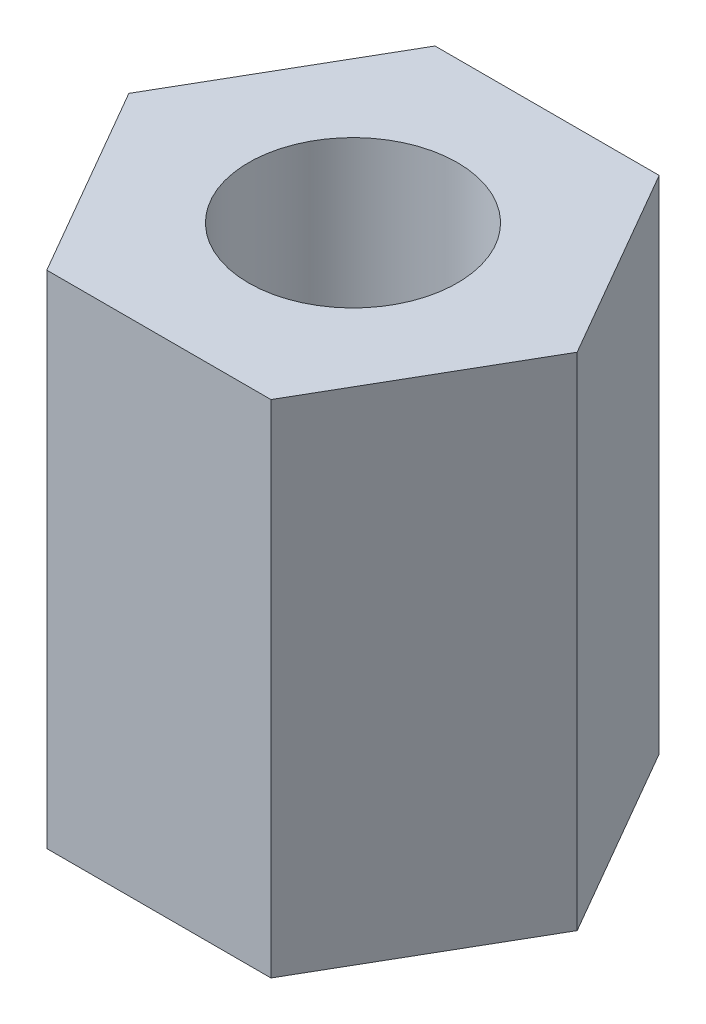
ISO-10303-21;
HEADER;
FILE_DESCRIPTION(('STEP AP214'),'2;1');
FILE_NAME('part.step','',(''),(''),'','','');
FILE_SCHEMA(('AUTOMOTIVE_DESIGN { 1 0 10303 214 1 1 1 1 }'));
ENDSEC;
DATA;
#1=APPLICATION_CONTEXT('core data for automotive mechanical design processes');
#2=APPLICATION_PROTOCOL_DEFINITION('international standard','automotive_design',2000,#1);
#3=PRODUCT_CONTEXT('',#1,'mechanical');
#4=PRODUCT('Part','Part','',(#3));
#5=PRODUCT_RELATED_PRODUCT_CATEGORY('part','',(#4));
#6=PRODUCT_DEFINITION_FORMATION('','',#4);
#7=PRODUCT_DEFINITION_CONTEXT('part definition',#1,'design');
#8=PRODUCT_DEFINITION('design','',#6,#7);
#9=PRODUCT_DEFINITION_SHAPE('','',#8);
#10=(LENGTH_UNIT() NAMED_UNIT(*) SI_UNIT(.MILLI.,.METRE.));
#11=(NAMED_UNIT(*) PLANE_ANGLE_UNIT() SI_UNIT($,.RADIAN.));
#12=(NAMED_UNIT(*) SI_UNIT($,.STERADIAN.) SOLID_ANGLE_UNIT());
#13=UNCERTAINTY_MEASURE_WITH_UNIT(LENGTH_MEASURE(1.E-05),#10,'distance_accuracy_value','');
#14=(GEOMETRIC_REPRESENTATION_CONTEXT(3) GLOBAL_UNCERTAINTY_ASSIGNED_CONTEXT((#13)) GLOBAL_UNIT_ASSIGNED_CONTEXT((#10,
#11,#12)) REPRESENTATION_CONTEXT('',''));
#15=CARTESIAN_POINT('',(0.,0.,0.));
#16=DIRECTION('',(0.,0.,1.));
#17=DIRECTION('',(1.,0.,0.));
#18=AXIS2_PLACEMENT_3D('',#15,#16,#17);
#19=CARTESIAN_POINT('',(1.34233937586591,6.,2.32499999999999));
#20=DIRECTION('',(-0.866025403784441,0.,-0.499999999999995));
#21=DIRECTION('',(-0.499999999999995,0.,0.866025403784442));
#22=AXIS2_PLACEMENT_3D('',#19,#20,#21);
#23=PLANE('',#22);
#24=DIRECTION('',(0.499999999999995,0.,-0.866025403784442));
#25=VECTOR('',#24,1.);
#26=CARTESIAN_POINT('',(1.34233937586591,0.,2.32499999999999));
#27=LINE('',#26,#25);
#28=CARTESIAN_POINT('',(1.34233937586591,0.,2.32499999999999));
#29=VERTEX_POINT('',#28);
#30=CARTESIAN_POINT('',(2.68467875173176,0.,0.));
#31=VERTEX_POINT('',#30);
#32=EDGE_CURVE('E128',#29,#31,#27,.T.);
#33=ORIENTED_EDGE('',*,*,#32,.T.);
#34=DIRECTION('',(0.,-1.,0.));
#35=VECTOR('',#34,1.);
#36=CARTESIAN_POINT('',(2.68467875173176,6.,0.));
#37=LINE('',#36,#35);
#38=CARTESIAN_POINT('',(2.68467875173176,6.,0.));
#39=VERTEX_POINT('',#38);
#40=EDGE_CURVE('E11',#39,#31,#37,.T.);
#41=ORIENTED_EDGE('',*,*,#40,.F.);
#42=DIRECTION('',(0.499999999999995,0.,-0.866025403784442));
#43=VECTOR('',#42,1.);
#44=CARTESIAN_POINT('',(1.34233937586591,6.,2.32499999999999));
#45=LINE('',#44,#43);
#46=CARTESIAN_POINT('',(1.34233937586591,6.,2.32499999999999));
#47=VERTEX_POINT('',#46);
#48=EDGE_CURVE('E145',#47,#39,#45,.T.);
#49=ORIENTED_EDGE('',*,*,#48,.F.);
#50=DIRECTION('',(0.,-1.,0.));
#51=VECTOR('',#50,1.);
#52=CARTESIAN_POINT('',(1.34233937586591,6.,2.32499999999999));
#53=LINE('',#52,#51);
#54=EDGE_CURVE('E124',#47,#29,#53,.T.);
#55=ORIENTED_EDGE('',*,*,#54,.T.);
#56=EDGE_LOOP('',(#33,#41,#49,#55));
#57=FACE_BOUND('',#56,.T.);
#58=ADVANCED_FACE('F39',(#57),#23,.F.);
#59=CARTESIAN_POINT('',(2.68467875173176,6.,0.));
#60=DIRECTION('',(-0.866025403784438,0.,0.500000000000001));
#61=DIRECTION('',(0.500000000000001,0.,0.866025403784438));
#62=AXIS2_PLACEMENT_3D('',#59,#60,#61);
#63=PLANE('',#62);
#64=DIRECTION('',(-0.500000000000001,0.,-0.866025403784438));
#65=VECTOR('',#64,1.);
#66=CARTESIAN_POINT('',(2.68467875173176,0.,0.));
#67=LINE('',#66,#65);
#68=CARTESIAN_POINT('',(1.34233937586588,0.,-2.32500000000001));
#69=VERTEX_POINT('',#68);
#70=EDGE_CURVE('E132',#31,#69,#67,.T.);
#71=ORIENTED_EDGE('',*,*,#70,.T.);
#72=DIRECTION('',(0.,-1.,0.));
#73=VECTOR('',#72,1.);
#74=CARTESIAN_POINT('',(1.34233937586588,6.,-2.32500000000001));
#75=LINE('',#74,#73);
#76=CARTESIAN_POINT('',(1.34233937586588,6.,-2.32500000000001));
#77=VERTEX_POINT('',#76);
#78=EDGE_CURVE('E48',#77,#69,#75,.T.);
#79=ORIENTED_EDGE('',*,*,#78,.F.);
#80=DIRECTION('',(-0.500000000000001,0.,-0.866025403784438));
#81=VECTOR('',#80,1.);
#82=CARTESIAN_POINT('',(2.68467875173176,6.,0.));
#83=LINE('',#82,#81);
#84=EDGE_CURVE('E93',#39,#77,#83,.T.);
#85=ORIENTED_EDGE('',*,*,#84,.F.);
#86=ORIENTED_EDGE('',*,*,#40,.T.);
#87=EDGE_LOOP('',(#71,#79,#85,#86));
#88=FACE_BOUND('',#87,.T.);
#89=ADVANCED_FACE('F174',(#88),#63,.F.);
#90=CARTESIAN_POINT('',(1.34233937586588,6.,-2.32500000000001));
#91=DIRECTION('',(0.,0.,1.));
#92=DIRECTION('',(1.,0.,0.));
#93=AXIS2_PLACEMENT_3D('',#90,#91,#92);
#94=PLANE('',#93);
#95=DIRECTION('',(-1.,0.,0.));
#96=VECTOR('',#95,1.);
#97=CARTESIAN_POINT('',(1.34233937586588,0.,-2.32500000000001));
#98=LINE('',#97,#96);
#99=CARTESIAN_POINT('',(-1.34233937586589,0.,-2.325));
#100=VERTEX_POINT('',#99);
#101=EDGE_CURVE('E136',#69,#100,#98,.T.);
#102=ORIENTED_EDGE('',*,*,#101,.T.);
#103=DIRECTION('',(0.,-1.,0.));
#104=VECTOR('',#103,1.);
#105=CARTESIAN_POINT('',(-1.34233937586589,6.,-2.325));
#106=LINE('',#105,#104);
#107=CARTESIAN_POINT('',(-1.34233937586589,6.,-2.325));
#108=VERTEX_POINT('',#107);
#109=EDGE_CURVE('E117',#108,#100,#106,.T.);
#110=ORIENTED_EDGE('',*,*,#109,.F.);
#111=DIRECTION('',(-1.,0.,0.));
#112=VECTOR('',#111,1.);
#113=CARTESIAN_POINT('',(1.34233937586588,6.,-2.32500000000001));
#114=LINE('',#113,#112);
#115=EDGE_CURVE('E106',#77,#108,#114,.T.);
#116=ORIENTED_EDGE('',*,*,#115,.F.);
#117=ORIENTED_EDGE('',*,*,#78,.T.);
#118=EDGE_LOOP('',(#102,#110,#116,#117));
#119=FACE_BOUND('',#118,.T.);
#120=ADVANCED_FACE('F155',(#119),#94,.F.);
#121=CARTESIAN_POINT('',(-1.34233937586589,6.,-2.325));
#122=DIRECTION('',(0.866025403784441,0.,0.499999999999995));
#123=DIRECTION('',(0.499999999999995,0.,-0.866025403784442));
#124=AXIS2_PLACEMENT_3D('',#121,#122,#123);
#125=PLANE('',#124);
#126=DIRECTION('',(-0.499999999999995,0.,0.866025403784442));
#127=VECTOR('',#126,1.);
#128=CARTESIAN_POINT('',(-1.34233937586589,0.,-2.325));
#129=LINE('',#128,#127);
#130=CARTESIAN_POINT('',(-2.68467875173176,0.,0.));
#131=VERTEX_POINT('',#130);
#132=EDGE_CURVE('E115',#100,#131,#129,.T.);
#133=ORIENTED_EDGE('',*,*,#132,.T.);
#134=DIRECTION('',(0.,-1.,0.));
#135=VECTOR('',#134,1.);
#136=CARTESIAN_POINT('',(-2.68467875173176,6.,0.));
#137=LINE('',#136,#135);
#138=CARTESIAN_POINT('',(-2.68467875173176,6.,0.));
#139=VERTEX_POINT('',#138);
#140=EDGE_CURVE('E112',#139,#131,#137,.T.);
#141=ORIENTED_EDGE('',*,*,#140,.F.);
#142=DIRECTION('',(-0.499999999999995,0.,0.866025403784442));
#143=VECTOR('',#142,1.);
#144=CARTESIAN_POINT('',(-1.34233937586589,6.,-2.325));
#145=LINE('',#144,#143);
#146=EDGE_CURVE('E100',#108,#139,#145,.T.);
#147=ORIENTED_EDGE('',*,*,#146,.F.);
#148=ORIENTED_EDGE('',*,*,#109,.T.);
#149=EDGE_LOOP('',(#133,#141,#147,#148));
#150=FACE_BOUND('',#149,.T.);
#151=ADVANCED_FACE('F113',(#150),#125,.F.);
#152=CARTESIAN_POINT('',(-2.68467875173176,6.,0.));
#153=DIRECTION('',(0.866025403784435,0.,-0.500000000000007));
#154=DIRECTION('',(-0.500000000000007,0.,-0.866025403784434));
#155=AXIS2_PLACEMENT_3D('',#152,#153,#154);
#156=PLANE('',#155);
#157=DIRECTION('',(0.500000000000007,0.,0.866025403784435));
#158=VECTOR('',#157,1.);
#159=CARTESIAN_POINT('',(-2.68467875173176,0.,0.));
#160=LINE('',#159,#158);
#161=CARTESIAN_POINT('',(-1.34233937586586,0.,2.32500000000001));
#162=VERTEX_POINT('',#161);
#163=EDGE_CURVE('E79',#131,#162,#160,.T.);
#164=ORIENTED_EDGE('',*,*,#163,.T.);
#165=DIRECTION('',(0.,-1.,0.));
#166=VECTOR('',#165,1.);
#167=CARTESIAN_POINT('',(-1.34233937586586,6.,2.32500000000001));
#168=LINE('',#167,#166);
#169=CARTESIAN_POINT('',(-1.34233937586586,6.,2.32500000000001));
#170=VERTEX_POINT('',#169);
#171=EDGE_CURVE('E118',#170,#162,#168,.T.);
#172=ORIENTED_EDGE('',*,*,#171,.F.);
#173=DIRECTION('',(0.500000000000007,0.,0.866025403784435));
#174=VECTOR('',#173,1.);
#175=CARTESIAN_POINT('',(-2.68467875173176,6.,0.));
#176=LINE('',#175,#174);
#177=EDGE_CURVE('E104',#139,#170,#176,.T.);
#178=ORIENTED_EDGE('',*,*,#177,.F.);
#179=ORIENTED_EDGE('',*,*,#140,.T.);
#180=EDGE_LOOP('',(#164,#172,#178,#179));
#181=FACE_BOUND('',#180,.T.);
#182=ADVANCED_FACE('F120',(#181),#156,.F.);
#183=CARTESIAN_POINT('',(-1.34233937586586,6.,2.32500000000001));
#184=DIRECTION('',(0.,0.,-1.));
#185=DIRECTION('',(-1.,0.,0.));
#186=AXIS2_PLACEMENT_3D('',#183,#184,#185);
#187=PLANE('',#186);
#188=DIRECTION('',(1.,0.,0.));
#189=VECTOR('',#188,1.);
#190=CARTESIAN_POINT('',(-1.34233937586586,0.,2.32500000000001));
#191=LINE('',#190,#189);
#192=EDGE_CURVE('E85',#162,#29,#191,.T.);
#193=ORIENTED_EDGE('',*,*,#192,.T.);
#194=ORIENTED_EDGE('',*,*,#54,.F.);
#195=DIRECTION('',(1.,0.,0.));
#196=VECTOR('',#195,1.);
#197=CARTESIAN_POINT('',(-1.34233937586586,6.,2.32500000000001));
#198=LINE('',#197,#196);
#199=EDGE_CURVE('E56',#170,#47,#198,.T.);
#200=ORIENTED_EDGE('',*,*,#199,.F.);
#201=ORIENTED_EDGE('',*,*,#171,.T.);
#202=EDGE_LOOP('',(#193,#194,#200,#201));
#203=FACE_BOUND('',#202,.T.);
#204=ADVANCED_FACE('F162',(#203),#187,.F.);
#205=CARTESIAN_POINT('',(0.,6.,0.));
#206=DIRECTION('',(0.,1.,0.));
#207=DIRECTION('',(0.,0.,1.));
#208=AXIS2_PLACEMENT_3D('',#205,#206,#207);
#209=PLANE('',#208);
#210=CARTESIAN_POINT('',(0.,6.,0.));
#211=DIRECTION('',(0.,1.,0.));
#212=DIRECTION('',(0.,0.,1.));
#213=AXIS2_PLACEMENT_3D('',#210,#211,#212);
#214=CIRCLE('',#213,1.25);
#215=CARTESIAN_POINT('',(0.,6.,1.25));
#216=VERTEX_POINT('',#215);
#217=EDGE_CURVE('E229',#216,#216,#214,.T.);
#218=ORIENTED_EDGE('',*,*,#217,.F.);
#219=EDGE_LOOP('',(#218));
#220=FACE_BOUND('',#219,.T.);
#221=ORIENTED_EDGE('',*,*,#48,.T.);
#222=ORIENTED_EDGE('',*,*,#84,.T.);
#223=ORIENTED_EDGE('',*,*,#115,.T.);
#224=ORIENTED_EDGE('',*,*,#146,.T.);
#225=ORIENTED_EDGE('',*,*,#177,.T.);
#226=ORIENTED_EDGE('',*,*,#199,.T.);
#227=EDGE_LOOP('',(#221,#222,#223,#224,#225,#226));
#228=FACE_BOUND('',#227,.T.);
#229=ADVANCED_FACE('F102',(#220,#228),#209,.T.);
#230=CARTESIAN_POINT('',(0.,0.,0.));
#231=DIRECTION('',(0.,1.,0.));
#232=DIRECTION('',(0.,0.,1.));
#233=AXIS2_PLACEMENT_3D('',#230,#231,#232);
#234=PLANE('',#233);
#235=CARTESIAN_POINT('',(0.,0.,0.));
#236=DIRECTION('',(0.,1.,0.));
#237=DIRECTION('',(0.,0.,1.));
#238=AXIS2_PLACEMENT_3D('',#235,#236,#237);
#239=CIRCLE('',#238,1.25);
#240=CARTESIAN_POINT('',(0.,0.,1.25));
#241=VERTEX_POINT('',#240);
#242=EDGE_CURVE('E133',#241,#241,#239,.T.);
#243=ORIENTED_EDGE('',*,*,#242,.T.);
#244=EDGE_LOOP('',(#243));
#245=FACE_BOUND('',#244,.T.);
#246=ORIENTED_EDGE('',*,*,#32,.F.);
#247=ORIENTED_EDGE('',*,*,#192,.F.);
#248=ORIENTED_EDGE('',*,*,#163,.F.);
#249=ORIENTED_EDGE('',*,*,#132,.F.);
#250=ORIENTED_EDGE('',*,*,#101,.F.);
#251=ORIENTED_EDGE('',*,*,#70,.F.);
#252=EDGE_LOOP('',(#246,#247,#248,#249,#250,#251));
#253=FACE_BOUND('',#252,.T.);
#254=ADVANCED_FACE('F158',(#245,#253),#234,.F.);
#255=CARTESIAN_POINT('',(0.,0.,0.));
#256=DIRECTION('',(0.,1.,0.));
#257=DIRECTION('',(0.,0.,1.));
#258=AXIS2_PLACEMENT_3D('',#255,#256,#257);
#259=CYLINDRICAL_SURFACE('',#258,1.25);
#260=ORIENTED_EDGE('',*,*,#242,.F.);
#261=EDGE_LOOP('',(#260));
#262=FACE_BOUND('',#261,.T.);
#263=ORIENTED_EDGE('',*,*,#217,.T.);
#264=EDGE_LOOP('',(#263));
#265=FACE_BOUND('',#264,.T.);
#266=ADVANCED_FACE('F211',(#262,#265),#259,.F.);
#267=CLOSED_SHELL('',(#58,#89,#120,#151,#182,#204,#229,#254,#266));
#268=MANIFOLD_SOLID_BREP('B2',#267);
#269=ADVANCED_BREP_SHAPE_REPRESENTATION('',(#18,#268),#14);
#270=SHAPE_DEFINITION_REPRESENTATION(#9,#269);
ENDSEC;
END-ISO-10303-21;
